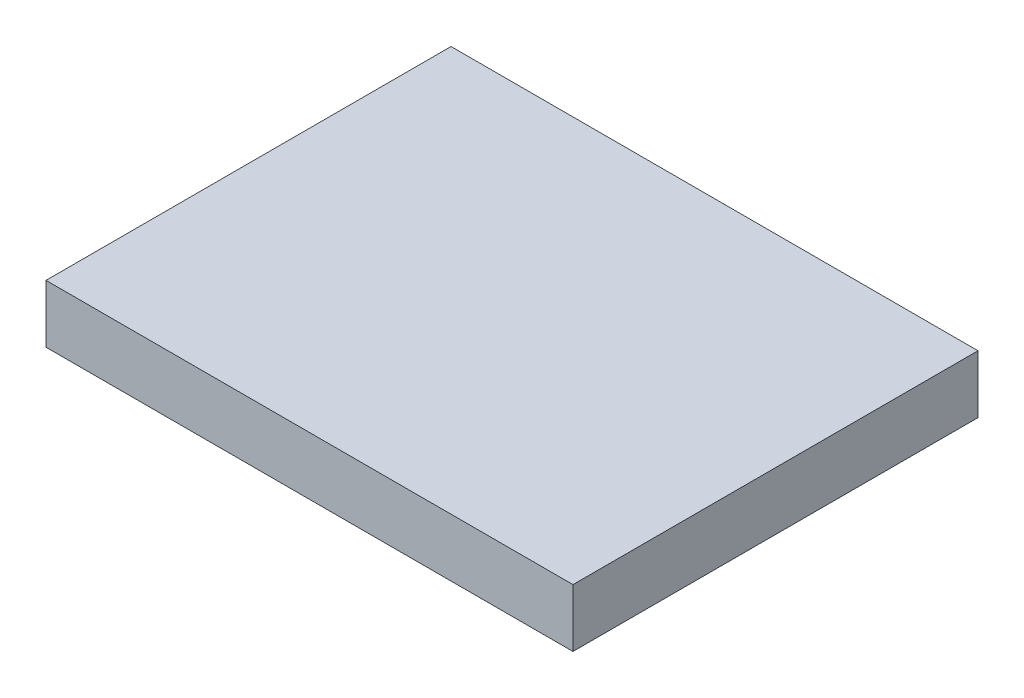
ISO-10303-21;
HEADER;
FILE_DESCRIPTION(('STEP AP214'),'2;1');
FILE_NAME('part.step','',(''),(''),'','','');
FILE_SCHEMA(('AUTOMOTIVE_DESIGN { 1 0 10303 214 1 1 1 1 }'));
ENDSEC;
DATA;
#1=APPLICATION_CONTEXT('core data for automotive mechanical design processes');
#2=APPLICATION_PROTOCOL_DEFINITION('international standard','automotive_design',2000,#1);
#3=PRODUCT_CONTEXT('',#1,'mechanical');
#4=PRODUCT('Part','Part','',(#3));
#5=PRODUCT_RELATED_PRODUCT_CATEGORY('part','',(#4));
#6=PRODUCT_DEFINITION_FORMATION('','',#4);
#7=PRODUCT_DEFINITION_CONTEXT('part definition',#1,'design');
#8=PRODUCT_DEFINITION('design','',#6,#7);
#9=PRODUCT_DEFINITION_SHAPE('','',#8);
#10=(LENGTH_UNIT() NAMED_UNIT(*) SI_UNIT(.MILLI.,.METRE.));
#11=(NAMED_UNIT(*) PLANE_ANGLE_UNIT() SI_UNIT($,.RADIAN.));
#12=(NAMED_UNIT(*) SI_UNIT($,.STERADIAN.) SOLID_ANGLE_UNIT());
#13=UNCERTAINTY_MEASURE_WITH_UNIT(LENGTH_MEASURE(1.E-05),#10,'distance_accuracy_value','');
#14=(GEOMETRIC_REPRESENTATION_CONTEXT(3) GLOBAL_UNCERTAINTY_ASSIGNED_CONTEXT((#13)) GLOBAL_UNIT_ASSIGNED_CONTEXT((#10,
#11,#12)) REPRESENTATION_CONTEXT('',''));
#15=CARTESIAN_POINT('',(0.,0.,0.));
#16=DIRECTION('',(0.,0.,1.));
#17=DIRECTION('',(1.,0.,0.));
#18=AXIS2_PLACEMENT_3D('',#15,#16,#17);
#19=CARTESIAN_POINT('',(45.4831200265407,10.,34.9591002331655));
#20=DIRECTION('',(-1.,0.,0.));
#21=DIRECTION('',(0.,0.,1.));
#22=AXIS2_PLACEMENT_3D('',#19,#20,#21);
#23=PLANE('',#22);
#24=DIRECTION('',(0.,0.,-1.));
#25=VECTOR('',#24,1.);
#26=CARTESIAN_POINT('',(45.4831200265407,0.,34.9591002331655));
#27=LINE('',#26,#25);
#28=CARTESIAN_POINT('',(45.4831200265407,0.,34.9591002331655));
#29=VERTEX_POINT('',#28);
#30=CARTESIAN_POINT('',(45.4831200265407,0.,-34.9591002331655));
#31=VERTEX_POINT('',#30);
#32=EDGE_CURVE('E98',#29,#31,#27,.T.);
#33=ORIENTED_EDGE('',*,*,#32,.T.);
#34=DIRECTION('',(0.,-1.,0.));
#35=VECTOR('',#34,1.);
#36=CARTESIAN_POINT('',(45.4831200265407,10.,-34.9591002331655));
#37=LINE('',#36,#35);
#38=CARTESIAN_POINT('',(45.4831200265407,10.,-34.9591002331655));
#39=VERTEX_POINT('',#38);
#40=EDGE_CURVE('E11',#39,#31,#37,.T.);
#41=ORIENTED_EDGE('',*,*,#40,.F.);
#42=DIRECTION('',(0.,0.,-1.));
#43=VECTOR('',#42,1.);
#44=CARTESIAN_POINT('',(45.4831200265407,10.,34.9591002331655));
#45=LINE('',#44,#43);
#46=CARTESIAN_POINT('',(45.4831200265407,10.,34.9591002331655));
#47=VERTEX_POINT('',#46);
#48=EDGE_CURVE('E86',#47,#39,#45,.T.);
#49=ORIENTED_EDGE('',*,*,#48,.F.);
#50=DIRECTION('',(0.,-1.,0.));
#51=VECTOR('',#50,1.);
#52=CARTESIAN_POINT('',(45.4831200265407,10.,34.9591002331655));
#53=LINE('',#52,#51);
#54=EDGE_CURVE('E94',#47,#29,#53,.T.);
#55=ORIENTED_EDGE('',*,*,#54,.T.);
#56=EDGE_LOOP('',(#33,#41,#49,#55));
#57=FACE_BOUND('',#56,.T.);
#58=ADVANCED_FACE('F35',(#57),#23,.F.);
#59=CARTESIAN_POINT('',(-45.4831200265407,10.,-34.9591002331655));
#60=DIRECTION('',(0.,0.,1.));
#61=DIRECTION('',(1.,0.,0.));
#62=AXIS2_PLACEMENT_3D('',#59,#60,#61);
#63=PLANE('',#62);
#64=DIRECTION('',(-1.,0.,0.));
#65=VECTOR('',#64,1.);
#66=CARTESIAN_POINT('',(-45.4831200265407,0.,-34.9591002331655));
#67=LINE('',#66,#65);
#68=CARTESIAN_POINT('',(-45.4831200265407,0.,-34.9591002331655));
#69=VERTEX_POINT('',#68);
#70=EDGE_CURVE('E90',#31,#69,#67,.T.);
#71=ORIENTED_EDGE('',*,*,#70,.T.);
#72=DIRECTION('',(0.,-1.,0.));
#73=VECTOR('',#72,1.);
#74=CARTESIAN_POINT('',(-45.4831200265407,10.,-34.9591002331655));
#75=LINE('',#74,#73);
#76=CARTESIAN_POINT('',(-45.4831200265407,10.,-34.9591002331655));
#77=VERTEX_POINT('',#76);
#78=EDGE_CURVE('E43',#77,#69,#75,.T.);
#79=ORIENTED_EDGE('',*,*,#78,.F.);
#80=DIRECTION('',(-1.,0.,0.));
#81=VECTOR('',#80,1.);
#82=CARTESIAN_POINT('',(-45.4831200265407,10.,-34.9591002331655));
#83=LINE('',#82,#81);
#84=EDGE_CURVE('E81',#39,#77,#83,.T.);
#85=ORIENTED_EDGE('',*,*,#84,.F.);
#86=ORIENTED_EDGE('',*,*,#40,.T.);
#87=EDGE_LOOP('',(#71,#79,#85,#86));
#88=FACE_BOUND('',#87,.T.);
#89=ADVANCED_FACE('F89',(#88),#63,.F.);
#90=CARTESIAN_POINT('',(-45.4831200265407,10.,34.9591002331655));
#91=DIRECTION('',(1.,0.,0.));
#92=DIRECTION('',(0.,0.,-1.));
#93=AXIS2_PLACEMENT_3D('',#90,#91,#92);
#94=PLANE('',#93);
#95=DIRECTION('',(0.,0.,1.));
#96=VECTOR('',#95,1.);
#97=CARTESIAN_POINT('',(-45.4831200265407,0.,34.9591002331655));
#98=LINE('',#97,#96);
#99=CARTESIAN_POINT('',(-45.4831200265407,0.,34.9591002331655));
#100=VERTEX_POINT('',#99);
#101=EDGE_CURVE('E68',#69,#100,#98,.T.);
#102=ORIENTED_EDGE('',*,*,#101,.T.);
#103=DIRECTION('',(0.,-1.,0.));
#104=VECTOR('',#103,1.);
#105=CARTESIAN_POINT('',(-45.4831200265407,10.,34.9591002331655));
#106=LINE('',#105,#104);
#107=CARTESIAN_POINT('',(-45.4831200265407,10.,34.9591002331655));
#108=VERTEX_POINT('',#107);
#109=EDGE_CURVE('E91',#108,#100,#106,.T.);
#110=ORIENTED_EDGE('',*,*,#109,.F.);
#111=DIRECTION('',(0.,0.,1.));
#112=VECTOR('',#111,1.);
#113=CARTESIAN_POINT('',(-45.4831200265407,10.,34.9591002331655));
#114=LINE('',#113,#112);
#115=EDGE_CURVE('E84',#77,#108,#114,.T.);
#116=ORIENTED_EDGE('',*,*,#115,.F.);
#117=ORIENTED_EDGE('',*,*,#78,.T.);
#118=EDGE_LOOP('',(#102,#110,#116,#117));
#119=FACE_BOUND('',#118,.T.);
#120=ADVANCED_FACE('F92',(#119),#94,.F.);
#121=CARTESIAN_POINT('',(-45.4831200265407,10.,34.9591002331655));
#122=DIRECTION('',(0.,0.,-1.));
#123=DIRECTION('',(-1.,0.,0.));
#124=AXIS2_PLACEMENT_3D('',#121,#122,#123);
#125=PLANE('',#124);
#126=DIRECTION('',(1.,0.,0.));
#127=VECTOR('',#126,1.);
#128=CARTESIAN_POINT('',(-45.4831200265407,0.,34.9591002331655));
#129=LINE('',#128,#127);
#130=EDGE_CURVE('E74',#100,#29,#129,.T.);
#131=ORIENTED_EDGE('',*,*,#130,.T.);
#132=ORIENTED_EDGE('',*,*,#54,.F.);
#133=DIRECTION('',(1.,0.,0.));
#134=VECTOR('',#133,1.);
#135=CARTESIAN_POINT('',(-45.4831200265407,10.,34.9591002331655));
#136=LINE('',#135,#134);
#137=EDGE_CURVE('E51',#108,#47,#136,.T.);
#138=ORIENTED_EDGE('',*,*,#137,.F.);
#139=ORIENTED_EDGE('',*,*,#109,.T.);
#140=EDGE_LOOP('',(#131,#132,#138,#139));
#141=FACE_BOUND('',#140,.T.);
#142=ADVANCED_FACE('F105',(#141),#125,.F.);
#143=CARTESIAN_POINT('',(0.,10.,0.));
#144=DIRECTION('',(0.,-1.,0.));
#145=DIRECTION('',(0.,0.,-1.));
#146=AXIS2_PLACEMENT_3D('',#143,#144,#145);
#147=PLANE('',#146);
#148=ORIENTED_EDGE('',*,*,#48,.T.);
#149=ORIENTED_EDGE('',*,*,#84,.T.);
#150=ORIENTED_EDGE('',*,*,#115,.T.);
#151=ORIENTED_EDGE('',*,*,#137,.T.);
#152=EDGE_LOOP('',(#148,#149,#150,#151));
#153=FACE_BOUND('',#152,.T.);
#154=ADVANCED_FACE('F82',(#153),#147,.F.);
#155=CARTESIAN_POINT('',(0.,0.,0.));
#156=DIRECTION('',(0.,-1.,0.));
#157=DIRECTION('',(0.,0.,-1.));
#158=AXIS2_PLACEMENT_3D('',#155,#156,#157);
#159=PLANE('',#158);
#160=ORIENTED_EDGE('',*,*,#32,.F.);
#161=ORIENTED_EDGE('',*,*,#130,.F.);
#162=ORIENTED_EDGE('',*,*,#101,.F.);
#163=ORIENTED_EDGE('',*,*,#70,.F.);
#164=EDGE_LOOP('',(#160,#161,#162,#163));
#165=FACE_BOUND('',#164,.T.);
#166=ADVANCED_FACE('F108',(#165),#159,.T.);
#167=CLOSED_SHELL('',(#58,#89,#120,#142,#154,#166));
#168=MANIFOLD_SOLID_BREP('B2',#167);
#169=ADVANCED_BREP_SHAPE_REPRESENTATION('',(#18,#168),#14);
#170=SHAPE_DEFINITION_REPRESENTATION(#9,#169);
ENDSEC;
END-ISO-10303-21;
